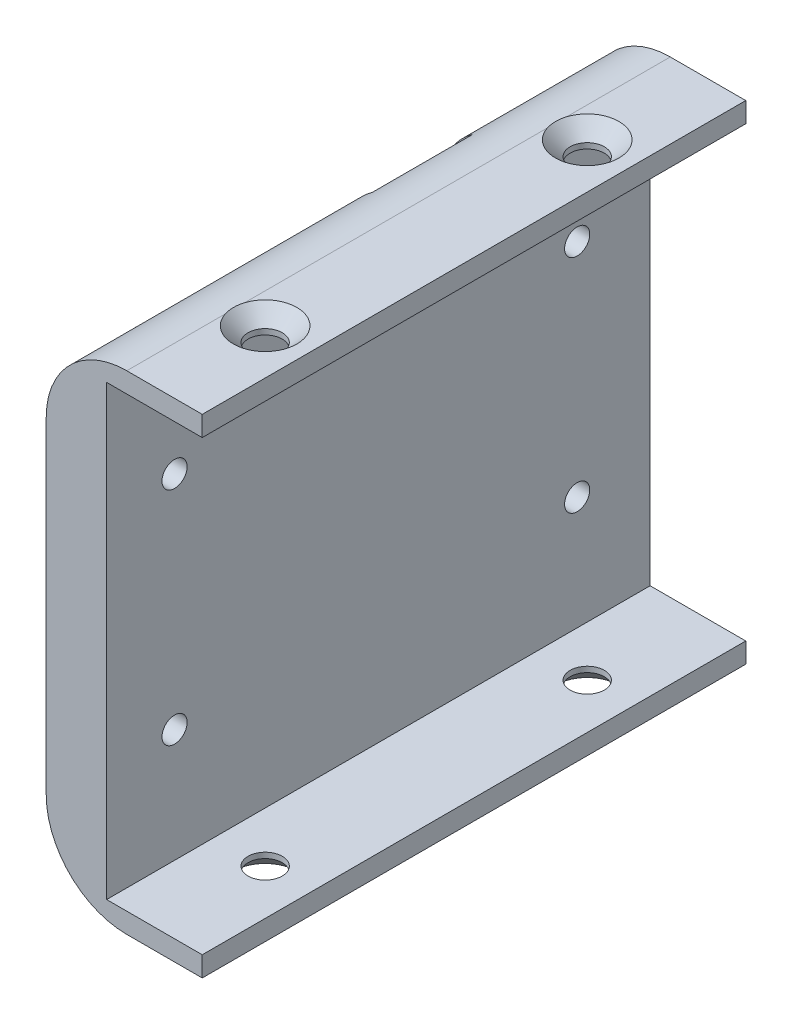
ISO-10303-21;
HEADER;
FILE_DESCRIPTION(('STEP AP214'),'2;1');
FILE_NAME('part.step','',(''),(''),'','','');
FILE_SCHEMA(('AUTOMOTIVE_DESIGN { 1 0 10303 214 1 1 1 1 }'));
ENDSEC;
DATA;
#1=APPLICATION_CONTEXT('core data for automotive mechanical design processes');
#2=APPLICATION_PROTOCOL_DEFINITION('international standard','automotive_design',2000,#1);
#3=PRODUCT_CONTEXT('',#1,'mechanical');
#4=PRODUCT('Part','Part','',(#3));
#5=PRODUCT_RELATED_PRODUCT_CATEGORY('part','',(#4));
#6=PRODUCT_DEFINITION_FORMATION('','',#4);
#7=PRODUCT_DEFINITION_CONTEXT('part definition',#1,'design');
#8=PRODUCT_DEFINITION('design','',#6,#7);
#9=PRODUCT_DEFINITION_SHAPE('','',#8);
#10=(LENGTH_UNIT() NAMED_UNIT(*) SI_UNIT(.MILLI.,.METRE.));
#11=(NAMED_UNIT(*) PLANE_ANGLE_UNIT() SI_UNIT($,.RADIAN.));
#12=(NAMED_UNIT(*) SI_UNIT($,.STERADIAN.) SOLID_ANGLE_UNIT());
#13=UNCERTAINTY_MEASURE_WITH_UNIT(LENGTH_MEASURE(1.E-05),#10,'distance_accuracy_value','');
#14=(GEOMETRIC_REPRESENTATION_CONTEXT(3) GLOBAL_UNCERTAINTY_ASSIGNED_CONTEXT((#13)) GLOBAL_UNIT_ASSIGNED_CONTEXT((#10,
#11,#12)) REPRESENTATION_CONTEXT('',''));
#15=CARTESIAN_POINT('',(0.,0.,0.));
#16=DIRECTION('',(0.,0.,1.));
#17=DIRECTION('',(1.,0.,0.));
#18=AXIS2_PLACEMENT_3D('',#15,#16,#17);
#19=CARTESIAN_POINT('',(-9.9999999999896,24.249999999995,9.25000000000013));
#20=DIRECTION('',(0.,1.,0.));
#21=DIRECTION('',(0.,0.,1.));
#22=AXIS2_PLACEMENT_3D('',#19,#20,#21);
#23=CONICAL_SURFACE('',#22,3.15000000001361,0.785398163397448);
#24=CARTESIAN_POINT('',(-13.0000000000176,24.25,10.2104686355886));
#25=CARTESIAN_POINT('',(-13.024069945026,24.2499950295218,10.1352624912886));
#26=CARTESIAN_POINT('',(-13.045207232172,24.249892138767,10.0591674018904));
#27=CARTESIAN_POINT('',(-13.0816261500583,24.2496051434966,9.90561200485988));
#28=CARTESIAN_POINT('',(-13.0969095696817,24.2494210638287,9.82815212187549));
#29=CARTESIAN_POINT('',(-13.1334525694306,24.2489263156326,9.59780586907413));
#30=CARTESIAN_POINT('',(-13.1464875956657,24.2486625714475,9.44351045960869));
#31=CARTESIAN_POINT('',(-13.1494043263025,24.2486028777726,9.20565171987819));
#32=CARTESIAN_POINT('',(-13.1471591255412,24.2486479387485,9.12207858869993));
#33=CARTESIAN_POINT('',(-13.1361384679381,24.2488438169427,8.95534151919602));
#34=CARTESIAN_POINT('',(-13.127363085835,24.2489946329506,8.87217757619812));
#35=CARTESIAN_POINT('',(-13.1029749505636,24.2493473092372,8.70478215642651));
#36=CARTESIAN_POINT('',(-13.087200332138,24.2495503269641,8.62057426481277));
#37=CARTESIAN_POINT('',(-13.0487673806669,24.2498719364405,8.45372552609859));
#38=CARTESIAN_POINT('',(-13.0261074441732,24.2499905085029,8.3710850487843));
#39=CARTESIAN_POINT('',(-13.0000000000198,24.25,8.28953136441849));
#40=B_SPLINE_CURVE_WITH_KNOTS('',3,(#24,#25,#26,#27,#28,#29,#30,#31,#32,#33,#34,#35,#36,#37,#38,
#39),.UNSPECIFIED.,.F.,.F.,(4,2,2,2,2,2,2,4),(0.,0.236743424387679,0.47341444453291,
0.936034161299941,1.18664393647095,1.43725084342283,1.69398264431785,1.95077427861946),.UNSPECIFIED.);
#41=CARTESIAN_POINT('',(-12.9999999999999,24.2499999999975,10.2104686356357));
#42=VERTEX_POINT('',#41);
#43=CARTESIAN_POINT('',(-13.0000000000098,24.2499999999975,8.28953136439546));
#44=VERTEX_POINT('',#43);
#45=EDGE_CURVE('E163',#42,#44,#40,.T.);
#46=ORIENTED_EDGE('',*,*,#45,.F.);
#47=CARTESIAN_POINT('',(-9.9999999999896,24.249999999995,9.25000000000013));
#48=DIRECTION('',(0.,1.,0.));
#49=DIRECTION('',(0.,0.,1.));
#50=AXIS2_PLACEMENT_3D('',#47,#48,#49);
#51=CIRCLE('',#50,3.15000000001361);
#52=EDGE_CURVE('E148',#42,#44,#51,.T.);
#53=ORIENTED_EDGE('',*,*,#52,.T.);
#54=EDGE_LOOP('',(#46,#53));
#55=FACE_BOUND('',#54,.T.);
#56=CARTESIAN_POINT('',(-9.9999999999896,22.8000000000021,9.25000000000013));
#57=DIRECTION('',(0.,1.,0.));
#58=DIRECTION('',(0.,0.,1.));
#59=AXIS2_PLACEMENT_3D('',#56,#57,#58);
#60=CIRCLE('',#59,1.69999999999999);
#61=CARTESIAN_POINT('',(-9.9999999999896,22.8000000000021,10.9500000000001));
#62=VERTEX_POINT('',#61);
#63=EDGE_CURVE('E281',#62,#62,#60,.F.);
#64=ORIENTED_EDGE('',*,*,#63,.T.);
#65=EDGE_LOOP('',(#64));
#66=FACE_BOUND('',#65,.T.);
#67=ADVANCED_FACE('F17',(#55,#66),#23,.F.);
#68=CARTESIAN_POINT('',(-9.99999999998963,24.2499999999382,41.2500000000001));
#69=DIRECTION('',(0.,1.,0.));
#70=DIRECTION('',(0.,0.,1.));
#71=AXIS2_PLACEMENT_3D('',#68,#69,#70);
#72=CONICAL_SURFACE('',#71,3.14999999999591,0.785398163417049);
#73=CARTESIAN_POINT('',(-13.0000000000536,24.2500000000032,42.2104686356002));
#74=CARTESIAN_POINT('',(-13.0240699450628,24.2499950295229,42.1352624913));
#75=CARTESIAN_POINT('',(-13.0452072322092,24.2498921387671,42.0591674019015));
#76=CARTESIAN_POINT('',(-13.0816261500958,24.2496051434959,41.9056120048703));
#77=CARTESIAN_POINT('',(-13.0969095697192,24.2494210638281,41.8281521218855));
#78=CARTESIAN_POINT('',(-13.1334525694682,24.2489263156322,41.597805869083));
#79=CARTESIAN_POINT('',(-13.1464875957037,24.2486625714468,41.4435104596168));
#80=CARTESIAN_POINT('',(-13.1494043263411,24.2486028777718,41.205651719884));
#81=CARTESIAN_POINT('',(-13.1471591255799,24.2486479387478,41.1220785887041));
#82=CARTESIAN_POINT('',(-13.1361384679768,24.2488438169421,40.955341519197));
#83=CARTESIAN_POINT('',(-13.1273630858738,24.24899463295,40.8721775761975));
#84=CARTESIAN_POINT('',(-13.1029749506022,24.2493473092367,40.7047821564227));
#85=CARTESIAN_POINT('',(-13.0872003321765,24.2495503269637,40.6205742648073));
#86=CARTESIAN_POINT('',(-13.0487673807049,24.2498719364403,40.4537255260898));
#87=CARTESIAN_POINT('',(-13.0261074442109,24.2499905085028,40.3710850487739));
#88=CARTESIAN_POINT('',(-13.0000000000571,24.25,40.2895313644065));
#89=B_SPLINE_CURVE_WITH_KNOTS('',3,(#73,#74,#75,#76,#77,#78,#79,#80,#81,#82,#83,#84,#85,#86,#87,
#88),.UNSPECIFIED.,.F.,.F.,(4,2,2,2,2,2,2,4),(0.,0.236743424388868,0.473414444535229,
0.936034161304567,1.18664393648036,1.437250843437,1.69398264433694,1.95077427864349),.UNSPECIFIED.);
#90=CARTESIAN_POINT('',(-12.9999999999999,24.2499999999691,42.2104686356709));
#91=VERTEX_POINT('',#90);
#92=CARTESIAN_POINT('',(-13.0000000000284,24.2499999999691,40.2895313644184));
#93=VERTEX_POINT('',#92);
#94=EDGE_CURVE('E143',#91,#93,#89,.T.);
#95=ORIENTED_EDGE('',*,*,#94,.F.);
#96=CARTESIAN_POINT('',(-9.99999999998963,24.2499999999382,41.2500000000001));
#97=DIRECTION('',(0.,1.,0.));
#98=DIRECTION('',(0.,0.,1.));
#99=AXIS2_PLACEMENT_3D('',#96,#97,#98);
#100=CIRCLE('',#99,3.14999999999591);
#101=EDGE_CURVE('E21',#91,#93,#100,.T.);
#102=ORIENTED_EDGE('',*,*,#101,.T.);
#103=EDGE_LOOP('',(#95,#102));
#104=FACE_BOUND('',#103,.T.);
#105=CARTESIAN_POINT('',(-9.99999999998963,22.8000000000021,41.2500000000001));
#106=DIRECTION('',(0.,1.,0.));
#107=DIRECTION('',(0.,0.,1.));
#108=AXIS2_PLACEMENT_3D('',#105,#106,#107);
#109=CIRCLE('',#108,1.69999999999999);
#110=CARTESIAN_POINT('',(-9.99999999998963,22.8000000000021,42.9500000000001));
#111=VERTEX_POINT('',#110);
#112=EDGE_CURVE('E278',#111,#111,#109,.F.);
#113=ORIENTED_EDGE('',*,*,#112,.T.);
#114=EDGE_LOOP('',(#113));
#115=FACE_BOUND('',#114,.T.);
#116=ADVANCED_FACE('F141',(#104,#115),#72,.F.);
#117=CARTESIAN_POINT('',(-9.99999999999993,-24.249999999995,9.25000000000013));
#118=DIRECTION('',(0.,-1.,0.));
#119=DIRECTION('',(0.,0.,-1.));
#120=AXIS2_PLACEMENT_3D('',#117,#118,#119);
#121=CONICAL_SURFACE('',#120,3.14999999999658,0.785398163397448);
#122=CARTESIAN_POINT('',(-13.0000000000014,-24.25,8.28953136438468));
#123=CARTESIAN_POINT('',(-13.0240699450105,-24.2499950295218,8.36473750868407));
#124=CARTESIAN_POINT('',(-13.0452072321573,-24.2498921387671,8.44083259808162));
#125=CARTESIAN_POINT('',(-13.0816261500451,-24.2496051434968,8.59438799511101));
#126=CARTESIAN_POINT('',(-13.0969095696693,-24.2494210638288,8.67184787809487));
#127=CARTESIAN_POINT('',(-13.1334525694204,-24.2489263156328,8.90219413089456));
#128=CARTESIAN_POINT('',(-13.1464875956571,-24.2486625714476,9.05648954035898));
#129=CARTESIAN_POINT('',(-13.1494043262965,-24.2486028777727,9.29434828009414));
#130=CARTESIAN_POINT('',(-13.1471591255357,-24.2486479387486,9.377921411278));
#131=CARTESIAN_POINT('',(-13.1361384679326,-24.2488438169428,9.54465848079309));
#132=CARTESIAN_POINT('',(-13.1273630858291,-24.2489946329507,9.62782242379657));
#133=CARTESIAN_POINT('',(-13.1029749505559,-24.2493473092373,9.79521784357958));
#134=CARTESIAN_POINT('',(-13.0872003321289,-24.2495503269642,9.87942573519912));
#135=CARTESIAN_POINT('',(-13.0487673806539,-24.2498719364406,10.0462744739246));
#136=CARTESIAN_POINT('',(-13.0261074441577,-24.2499905085029,10.1289149512444));
#137=CARTESIAN_POINT('',(-13.0000000000014,-24.25,10.2104686356156));
#138=B_SPLINE_CURVE_WITH_KNOTS('',3,(#122,#123,#124,#125,#126,#127,#128,#129,#130,#131,#132,
#133,#134,#135,#136,#137),.UNSPECIFIED.,.F.,.F.,(4,2,2,2,2,2,2,4),(0.,0.236743424386538,
0.473414444530611,0.936034161294968,1.1866439364827,1.43725084345131,1.69398264436416,
1.95077427868361),.UNSPECIFIED.);
#139=CARTESIAN_POINT('',(-13.0000000000007,-24.2500000000018,8.28953136437658));
#140=VERTEX_POINT('',#139);
#141=CARTESIAN_POINT('',(-13.0000000000007,-24.2499999999975,10.2104686356097));
#142=VERTEX_POINT('',#141);
#143=EDGE_CURVE('E341',#140,#142,#138,.T.);
#144=ORIENTED_EDGE('',*,*,#143,.F.);
#145=CARTESIAN_POINT('',(-9.99999999999993,-24.249999999995,9.25000000000013));
#146=DIRECTION('',(0.,-1.,0.));
#147=DIRECTION('',(0.,0.,-1.));
#148=AXIS2_PLACEMENT_3D('',#145,#146,#147);
#149=CIRCLE('',#148,3.14999999999658);
#150=EDGE_CURVE('E337',#140,#142,#149,.T.);
#151=ORIENTED_EDGE('',*,*,#150,.T.);
#152=EDGE_LOOP('',(#144,#151));
#153=FACE_BOUND('',#152,.T.);
#154=CARTESIAN_POINT('',(-9.99999999999993,-22.8,9.25000000000013));
#155=DIRECTION('',(0.,-1.,0.));
#156=DIRECTION('',(0.,0.,-1.));
#157=AXIS2_PLACEMENT_3D('',#154,#155,#156);
#158=CIRCLE('',#157,1.69999999999999);
#159=CARTESIAN_POINT('',(-9.99999999999993,-22.8,7.55000000000014));
#160=VERTEX_POINT('',#159);
#161=EDGE_CURVE('E172',#160,#160,#158,.F.);
#162=ORIENTED_EDGE('',*,*,#161,.T.);
#163=EDGE_LOOP('',(#162));
#164=FACE_BOUND('',#163,.T.);
#165=ADVANCED_FACE('F356',(#153,#164),#121,.F.);
#166=CARTESIAN_POINT('',(-9.99999999999996,-24.249999999995,41.2500000000001));
#167=DIRECTION('',(0.,-1.,0.));
#168=DIRECTION('',(0.,0.,-1.));
#169=AXIS2_PLACEMENT_3D('',#166,#167,#168);
#170=CONICAL_SURFACE('',#169,3.15000000001428,0.785398163397448);
#171=CARTESIAN_POINT('',(-13.0000000000176,-24.2500000000017,40.2895313643794));
#172=CARTESIAN_POINT('',(-13.0240699450273,-24.2499950295224,40.3647375086791));
#173=CARTESIAN_POINT('',(-13.0452072321743,-24.2498921387671,40.4408325980771));
#174=CARTESIAN_POINT('',(-13.0816261500624,-24.2496051434964,40.5943879951074));
#175=CARTESIAN_POINT('',(-13.0969095696865,-24.2494210638286,40.6718478780918));
#176=CARTESIAN_POINT('',(-13.1334525694378,-24.2489263156326,40.9021941308929));
#177=CARTESIAN_POINT('',(-13.1464875956745,-24.2486625714473,41.0564895403582));
#178=CARTESIAN_POINT('',(-13.1494043263139,-24.2486028777723,41.2943482800947));
#179=CARTESIAN_POINT('',(-13.1471591255531,-24.2486479387483,41.377921411279));
#180=CARTESIAN_POINT('',(-13.1361384679499,-24.2488438169425,41.5446584807949));
#181=CARTESIAN_POINT('',(-13.1273630858465,-24.2489946329504,41.6278224237988));
#182=CARTESIAN_POINT('',(-13.1029749505731,-24.2493473092371,41.7952178435826));
#183=CARTESIAN_POINT('',(-13.0872003321461,-24.249550326964,41.8794257352026));
#184=CARTESIAN_POINT('',(-13.048767380671,-24.2498719364405,42.0462744739289));
#185=CARTESIAN_POINT('',(-13.0261074441748,-24.2499905085029,42.1289149512491));
#186=CARTESIAN_POINT('',(-13.0000000000184,-24.25,42.2104686356207));
#187=B_SPLINE_CURVE_WITH_KNOTS('',3,(#171,#172,#173,#174,#175,#176,#177,#178,#179,#180,#181,
#182,#183,#184,#185,#186),.UNSPECIFIED.,.F.,.F.,(4,2,2,2,2,2,2,4),(0.,0.236743424387996,
0.473414444533513,0.936034161300674,1.18664393648962,1.43725084345944,1.69398264437354,
1.95077427869423),.UNSPECIFIED.);
#188=CARTESIAN_POINT('',(-13.0000000000091,-24.2499999999929,40.2895313643738));
#189=VERTEX_POINT('',#188);
#190=CARTESIAN_POINT('',(-13.0000000000091,-24.2499999999975,42.2104686356415));
#191=VERTEX_POINT('',#190);
#192=EDGE_CURVE('E350',#189,#191,#187,.T.);
#193=ORIENTED_EDGE('',*,*,#192,.F.);
#194=CARTESIAN_POINT('',(-9.99999999999996,-24.249999999995,41.2500000000001));
#195=DIRECTION('',(0.,-1.,0.));
#196=DIRECTION('',(0.,0.,-1.));
#197=AXIS2_PLACEMENT_3D('',#194,#195,#196);
#198=CIRCLE('',#197,3.15000000001428);
#199=EDGE_CURVE('E332',#189,#191,#198,.T.);
#200=ORIENTED_EDGE('',*,*,#199,.T.);
#201=EDGE_LOOP('',(#193,#200));
#202=FACE_BOUND('',#201,.T.);
#203=CARTESIAN_POINT('',(-9.99999999999996,-22.8,41.2500000000001));
#204=DIRECTION('',(0.,-1.,0.));
#205=DIRECTION('',(0.,0.,-1.));
#206=AXIS2_PLACEMENT_3D('',#203,#204,#205);
#207=CIRCLE('',#206,1.69999999999999);
#208=CARTESIAN_POINT('',(-9.99999999999996,-22.8,39.5500000000001));
#209=VERTEX_POINT('',#208);
#210=EDGE_CURVE('E275',#209,#209,#207,.F.);
#211=ORIENTED_EDGE('',*,*,#210,.T.);
#212=EDGE_LOOP('',(#211));
#213=FACE_BOUND('',#212,.T.);
#214=ADVANCED_FACE('F391',(#202,#213),#170,.F.);
#215=CARTESIAN_POINT('',(-9.9999999999896,24.2500000000021,9.25000000000013));
#216=DIRECTION('',(0.,1.,0.));
#217=DIRECTION('',(0.,0.,1.));
#218=AXIS2_PLACEMENT_3D('',#215,#216,#217);
#219=CYLINDRICAL_SURFACE('',#218,1.69999999999999);
#220=CARTESIAN_POINT('',(-9.9999999999896,22.2499999999992,9.25000000000013));
#221=DIRECTION('',(0.,1.,0.));
#222=DIRECTION('',(0.,0.,1.));
#223=AXIS2_PLACEMENT_3D('',#220,#221,#222);
#224=CIRCLE('',#223,1.69999999999999);
#225=CARTESIAN_POINT('',(-9.9999999999896,22.2499999999992,10.9500000000001));
#226=VERTEX_POINT('',#225);
#227=EDGE_CURVE('E313',#226,#226,#224,.F.);
#228=ORIENTED_EDGE('',*,*,#227,.T.);
#229=EDGE_LOOP('',(#228));
#230=FACE_BOUND('',#229,.T.);
#231=ORIENTED_EDGE('',*,*,#63,.F.);
#232=EDGE_LOOP('',(#231));
#233=FACE_BOUND('',#232,.T.);
#234=ADVANCED_FACE('F543',(#230,#233),#219,.F.);
#235=CARTESIAN_POINT('',(-9.99999999998963,24.2500000000021,41.2500000000001));
#236=DIRECTION('',(0.,1.,0.));
#237=DIRECTION('',(0.,0.,1.));
#238=AXIS2_PLACEMENT_3D('',#235,#236,#237);
#239=CYLINDRICAL_SURFACE('',#238,1.69999999999999);
#240=CARTESIAN_POINT('',(-9.99999999998963,22.2499999999992,41.2500000000001));
#241=DIRECTION('',(0.,1.,0.));
#242=DIRECTION('',(0.,0.,1.));
#243=AXIS2_PLACEMENT_3D('',#240,#241,#242);
#244=CIRCLE('',#243,1.69999999999999);
#245=CARTESIAN_POINT('',(-9.99999999998963,22.2499999999992,42.9500000000001));
#246=VERTEX_POINT('',#245);
#247=EDGE_CURVE('E189',#246,#246,#244,.F.);
#248=ORIENTED_EDGE('',*,*,#247,.T.);
#249=EDGE_LOOP('',(#248));
#250=FACE_BOUND('',#249,.T.);
#251=ORIENTED_EDGE('',*,*,#112,.F.);
#252=EDGE_LOOP('',(#251));
#253=FACE_BOUND('',#252,.T.);
#254=ADVANCED_FACE('F539',(#250,#253),#239,.F.);
#255=CARTESIAN_POINT('',(-9.99999999999996,-24.25,41.2500000000001));
#256=DIRECTION('',(0.,-1.,0.));
#257=DIRECTION('',(0.,0.,-1.));
#258=AXIS2_PLACEMENT_3D('',#255,#256,#257);
#259=CYLINDRICAL_SURFACE('',#258,1.69999999999999);
#260=CARTESIAN_POINT('',(-9.99999999999996,-22.2500000000009,41.2500000000001));
#261=DIRECTION('',(0.,-1.,0.));
#262=DIRECTION('',(0.,0.,-1.));
#263=AXIS2_PLACEMENT_3D('',#260,#261,#262);
#264=CIRCLE('',#263,1.69999999999999);
#265=CARTESIAN_POINT('',(-9.99999999999996,-22.2500000000009,39.5500000000001));
#266=VERTEX_POINT('',#265);
#267=EDGE_CURVE('E223',#266,#266,#264,.F.);
#268=ORIENTED_EDGE('',*,*,#267,.T.);
#269=EDGE_LOOP('',(#268));
#270=FACE_BOUND('',#269,.T.);
#271=ORIENTED_EDGE('',*,*,#210,.F.);
#272=EDGE_LOOP('',(#271));
#273=FACE_BOUND('',#272,.T.);
#274=ADVANCED_FACE('F533',(#270,#273),#259,.F.);
#275=CARTESIAN_POINT('',(-9.99999999999993,-24.25,9.25000000000013));
#276=DIRECTION('',(0.,-1.,0.));
#277=DIRECTION('',(0.,0.,-1.));
#278=AXIS2_PLACEMENT_3D('',#275,#276,#277);
#279=CYLINDRICAL_SURFACE('',#278,1.69999999999999);
#280=CARTESIAN_POINT('',(-9.99999999999993,-22.2500000000009,9.25000000000013));
#281=DIRECTION('',(0.,-1.,0.));
#282=DIRECTION('',(0.,0.,-1.));
#283=AXIS2_PLACEMENT_3D('',#280,#281,#282);
#284=CIRCLE('',#283,1.69999999999999);
#285=CARTESIAN_POINT('',(-9.99999999999993,-22.2500000000009,7.55000000000014));
#286=VERTEX_POINT('',#285);
#287=EDGE_CURVE('E219',#286,#286,#284,.F.);
#288=ORIENTED_EDGE('',*,*,#287,.T.);
#289=EDGE_LOOP('',(#288));
#290=FACE_BOUND('',#289,.T.);
#291=ORIENTED_EDGE('',*,*,#161,.F.);
#292=EDGE_LOOP('',(#291));
#293=FACE_BOUND('',#292,.T.);
#294=ADVANCED_FACE('F528',(#290,#293),#279,.F.);
#295=CARTESIAN_POINT('',(-5.49999999999992,22.2499999999992,103.416598472404));
#296=DIRECTION('',(-1.,0.,0.));
#297=DIRECTION('',(0.,0.,1.));
#298=AXIS2_PLACEMENT_3D('',#295,#296,#297);
#299=PLANE('',#298);
#300=DIRECTION('',(0.,0.,1.));
#301=VECTOR('',#300,1.);
#302=CARTESIAN_POINT('',(-5.49999999999992,22.2499999999992,103.416598472404));
#303=LINE('',#302,#301);
#304=CARTESIAN_POINT('',(-5.49999999999992,22.2499999999992,52.));
#305=VERTEX_POINT('',#304);
#306=CARTESIAN_POINT('',(-5.49999999999992,22.2499999999992,-2.));
#307=VERTEX_POINT('',#306);
#308=EDGE_CURVE('E185',#305,#307,#303,.F.);
#309=ORIENTED_EDGE('',*,*,#308,.T.);
#310=DIRECTION('',(0.,1.,0.));
#311=VECTOR('',#310,1.);
#312=CARTESIAN_POINT('',(-5.49999999999992,-16.25,-2.));
#313=LINE('',#312,#311);
#314=CARTESIAN_POINT('',(-5.49999999999992,24.25,-2.));
#315=VERTEX_POINT('',#314);
#316=EDGE_CURVE('E201',#315,#307,#313,.F.);
#317=ORIENTED_EDGE('',*,*,#316,.F.);
#318=DIRECTION('',(0.,0.,-1.));
#319=VECTOR('',#318,1.);
#320=CARTESIAN_POINT('',(-5.49999999999992,24.25,103.416598472404));
#321=LINE('',#320,#319);
#322=CARTESIAN_POINT('',(-5.49999999999992,24.25,52.));
#323=VERTEX_POINT('',#322);
#324=EDGE_CURVE('E149',#315,#323,#321,.F.);
#325=ORIENTED_EDGE('',*,*,#324,.T.);
#326=DIRECTION('',(0.,-1.,0.));
#327=VECTOR('',#326,1.);
#328=CARTESIAN_POINT('',(-5.49999999999992,0.,52.0000000000001));
#329=LINE('',#328,#327);
#330=EDGE_CURVE('E175',#305,#323,#329,.F.);
#331=ORIENTED_EDGE('',*,*,#330,.F.);
#332=EDGE_LOOP('',(#309,#317,#325,#331));
#333=FACE_BOUND('',#332,.T.);
#334=ADVANCED_FACE('F526',(#333),#299,.F.);
#335=CARTESIAN_POINT('',(-5.49999999999992,24.25,103.416598472404));
#336=DIRECTION('',(0.,-1.,0.));
#337=DIRECTION('',(0.,0.,-1.));
#338=AXIS2_PLACEMENT_3D('',#335,#336,#337);
#339=PLANE('',#338);
#340=ORIENTED_EDGE('',*,*,#52,.F.);
#341=DIRECTION('',(0.,0.,-1.));
#342=VECTOR('',#341,1.);
#343=CARTESIAN_POINT('',(-12.9999999999999,24.25,103.416598472404));
#344=LINE('',#343,#342);
#345=EDGE_CURVE('E154',#93,#42,#344,.T.);
#346=ORIENTED_EDGE('',*,*,#345,.F.);
#347=ORIENTED_EDGE('',*,*,#101,.F.);
#348=DIRECTION('',(0.,0.,-1.));
#349=VECTOR('',#348,1.);
#350=CARTESIAN_POINT('',(-12.9999999999999,24.25,103.416598472404));
#351=LINE('',#350,#349);
#352=CARTESIAN_POINT('',(-12.9999999999999,24.25,52.0000000000001));
#353=VERTEX_POINT('',#352);
#354=EDGE_CURVE('E157',#353,#91,#351,.T.);
#355=ORIENTED_EDGE('',*,*,#354,.F.);
#356=DIRECTION('',(1.,0.,0.));
#357=VECTOR('',#356,1.);
#358=CARTESIAN_POINT('',(29.5701693961332,24.25,52.));
#359=LINE('',#358,#357);
#360=EDGE_CURVE('E177',#323,#353,#359,.F.);
#361=ORIENTED_EDGE('',*,*,#360,.F.);
#362=ORIENTED_EDGE('',*,*,#324,.F.);
#363=DIRECTION('',(-1.,0.,0.));
#364=VECTOR('',#363,1.);
#365=CARTESIAN_POINT('',(-12.9999999999999,24.25,-2.));
#366=LINE('',#365,#364);
#367=CARTESIAN_POINT('',(-12.9999999999999,24.25,-2.));
#368=VERTEX_POINT('',#367);
#369=EDGE_CURVE('E204',#368,#315,#366,.F.);
#370=ORIENTED_EDGE('',*,*,#369,.F.);
#371=DIRECTION('',(0.,0.,-1.));
#372=VECTOR('',#371,1.);
#373=CARTESIAN_POINT('',(-12.9999999999999,24.25,103.416598472404));
#374=LINE('',#373,#372);
#375=EDGE_CURVE('E165',#44,#368,#374,.T.);
#376=ORIENTED_EDGE('',*,*,#375,.F.);
#377=EDGE_LOOP('',(#340,#346,#347,#355,#361,#362,#370,#376));
#378=FACE_BOUND('',#377,.T.);
#379=ADVANCED_FACE('F160',(#378),#339,.F.);
#380=CARTESIAN_POINT('',(-12.9999999999999,16.25,103.416598472404));
#381=DIRECTION('',(0.,0.,-1.));
#382=DIRECTION('',(-1.,0.,0.));
#383=AXIS2_PLACEMENT_3D('',#380,#381,#382);
#384=CYLINDRICAL_SURFACE('',#383,8.00000000000004);
#385=ORIENTED_EDGE('',*,*,#354,.T.);
#386=ORIENTED_EDGE('',*,*,#94,.T.);
#387=ORIENTED_EDGE('',*,*,#345,.T.);
#388=ORIENTED_EDGE('',*,*,#45,.T.);
#389=ORIENTED_EDGE('',*,*,#375,.T.);
#390=CARTESIAN_POINT('',(-12.9999999999999,16.25,-2.));
#391=DIRECTION('',(0.,0.,-1.));
#392=DIRECTION('',(-1.,0.,0.));
#393=AXIS2_PLACEMENT_3D('',#390,#391,#392);
#394=CIRCLE('',#393,8.00000000000004);
#395=CARTESIAN_POINT('',(-20.9999999999999,16.25,-2.));
#396=VERTEX_POINT('',#395);
#397=EDGE_CURVE('E304',#396,#368,#394,.T.);
#398=ORIENTED_EDGE('',*,*,#397,.F.);
#399=DIRECTION('',(0.,0.,1.));
#400=VECTOR('',#399,1.);
#401=CARTESIAN_POINT('',(-20.9999999999999,16.25,103.416598472404));
#402=LINE('',#401,#400);
#403=CARTESIAN_POINT('',(-20.9999999999999,16.25,52.0000000000001));
#404=VERTEX_POINT('',#403);
#405=EDGE_CURVE('E158',#396,#404,#402,.T.);
#406=ORIENTED_EDGE('',*,*,#405,.T.);
#407=CARTESIAN_POINT('',(-12.9999999999999,16.25,52.0000000000001));
#408=DIRECTION('',(0.,0.,-1.));
#409=DIRECTION('',(-1.,0.,0.));
#410=AXIS2_PLACEMENT_3D('',#407,#408,#409);
#411=CIRCLE('',#410,8.00000000000004);
#412=EDGE_CURVE('E298',#353,#404,#411,.F.);
#413=ORIENTED_EDGE('',*,*,#412,.F.);
#414=EDGE_LOOP('',(#385,#386,#387,#388,#389,#398,#406,#413));
#415=FACE_BOUND('',#414,.T.);
#416=DIRECTION('',(0.,0.,1.));
#417=VECTOR('',#416,1.);
#418=CARTESIAN_POINT('',(-20.2144610189473,19.7071017060666,23.));
#419=LINE('',#418,#417);
#420=CARTESIAN_POINT('',(-20.2144610189473,19.7071017060666,23.));
#421=VERTEX_POINT('',#420);
#422=CARTESIAN_POINT('',(-20.2144610189473,19.7071017060666,13.));
#423=VERTEX_POINT('',#422);
#424=EDGE_CURVE('E259',#421,#423,#419,.F.);
#425=ORIENTED_EDGE('',*,*,#424,.T.);
#426=CARTESIAN_POINT('',(-12.9999999999999,16.25,13.));
#427=DIRECTION('',(0.,0.,-1.));
#428=DIRECTION('',(-1.,0.,0.));
#429=AXIS2_PLACEMENT_3D('',#426,#427,#428);
#430=CIRCLE('',#429,8.00000000000004);
#431=CARTESIAN_POINT('',(-17.6268087939806,22.7763037305923,13.));
#432=VERTEX_POINT('',#431);
#433=EDGE_CURVE('E270',#423,#432,#430,.T.);
#434=ORIENTED_EDGE('',*,*,#433,.T.);
#435=DIRECTION('',(0.,0.,1.));
#436=VECTOR('',#435,1.);
#437=CARTESIAN_POINT('',(-17.6268087939806,22.7763037305923,23.));
#438=LINE('',#437,#436);
#439=CARTESIAN_POINT('',(-17.6268087939806,22.7763037305923,23.));
#440=VERTEX_POINT('',#439);
#441=EDGE_CURVE('E226',#432,#440,#438,.T.);
#442=ORIENTED_EDGE('',*,*,#441,.T.);
#443=CARTESIAN_POINT('',(-12.9999999999999,16.25,23.));
#444=DIRECTION('',(0.,0.,-1.));
#445=DIRECTION('',(-1.,0.,0.));
#446=AXIS2_PLACEMENT_3D('',#443,#444,#445);
#447=CIRCLE('',#446,8.00000000000004);
#448=EDGE_CURVE('E263',#440,#421,#447,.F.);
#449=ORIENTED_EDGE('',*,*,#448,.T.);
#450=EDGE_LOOP('',(#425,#434,#442,#449));
#451=FACE_BOUND('',#450,.T.);
#452=ADVANCED_FACE('F152',(#415,#451),#384,.T.);
#453=CARTESIAN_POINT('',(-20.9999999999999,-16.25,103.416598472404));
#454=DIRECTION('',(1.,0.,0.));
#455=DIRECTION('',(0.,1.,0.));
#456=AXIS2_PLACEMENT_3D('',#453,#454,#455);
#457=PLANE('',#456);
#458=ORIENTED_EDGE('',*,*,#405,.F.);
#459=DIRECTION('',(0.,1.,0.));
#460=VECTOR('',#459,1.);
#461=CARTESIAN_POINT('',(-20.9999999999999,-16.25,-2.));
#462=LINE('',#461,#460);
#463=CARTESIAN_POINT('',(-20.9999999999999,-16.25,-2.));
#464=VERTEX_POINT('',#463);
#465=EDGE_CURVE('E307',#464,#396,#462,.T.);
#466=ORIENTED_EDGE('',*,*,#465,.F.);
#467=DIRECTION('',(0.,0.,-1.));
#468=VECTOR('',#467,1.);
#469=CARTESIAN_POINT('',(-20.9999999999999,-16.25,103.416598472404));
#470=LINE('',#469,#468);
#471=CARTESIAN_POINT('',(-20.9999999999999,-16.25,52.0000000000001));
#472=VERTEX_POINT('',#471);
#473=EDGE_CURVE('E349',#472,#464,#470,.T.);
#474=ORIENTED_EDGE('',*,*,#473,.F.);
#475=DIRECTION('',(0.,-1.,0.));
#476=VECTOR('',#475,1.);
#477=CARTESIAN_POINT('',(-20.9999999999999,0.,52.0000000000001));
#478=LINE('',#477,#476);
#479=EDGE_CURVE('E297',#404,#472,#478,.T.);
#480=ORIENTED_EDGE('',*,*,#479,.F.);
#481=EDGE_LOOP('',(#458,#466,#474,#480));
#482=FACE_BOUND('',#481,.T.);
#483=CARTESIAN_POINT('',(-20.9999999999999,10.9999999999999,5.24999999999997));
#484=DIRECTION('',(-1.,0.,0.));
#485=DIRECTION('',(0.,-1.,0.));
#486=AXIS2_PLACEMENT_3D('',#483,#484,#485);
#487=CIRCLE('',#486,1.25000000000092);
#488=CARTESIAN_POINT('',(-20.9999999999999,9.749999999999,5.24999999999997));
#489=VERTEX_POINT('',#488);
#490=EDGE_CURVE('E316',#489,#489,#487,.F.);
#491=ORIENTED_EDGE('',*,*,#490,.T.);
#492=EDGE_LOOP('',(#491));
#493=FACE_BOUND('',#492,.T.);
#494=CARTESIAN_POINT('',(-20.9999999999999,-11.0000000000001,45.25));
#495=DIRECTION('',(-1.,0.,0.));
#496=DIRECTION('',(0.,-1.,0.));
#497=AXIS2_PLACEMENT_3D('',#494,#495,#496);
#498=CIRCLE('',#497,1.25000000000092);
#499=CARTESIAN_POINT('',(-20.9999999999999,-12.250000000001,45.25));
#500=VERTEX_POINT('',#499);
#501=EDGE_CURVE('E319',#500,#500,#498,.F.);
#502=ORIENTED_EDGE('',*,*,#501,.T.);
#503=EDGE_LOOP('',(#502));
#504=FACE_BOUND('',#503,.T.);
#505=CARTESIAN_POINT('',(-20.9999999999999,-11.0000000000001,5.24999999999997));
#506=DIRECTION('',(-1.,0.,0.));
#507=DIRECTION('',(0.,-1.,0.));
#508=AXIS2_PLACEMENT_3D('',#505,#506,#507);
#509=CIRCLE('',#508,1.25000000000091);
#510=CARTESIAN_POINT('',(-20.9999999999999,-12.250000000001,5.24999999999997));
#511=VERTEX_POINT('',#510);
#512=EDGE_CURVE('E322',#511,#511,#509,.F.);
#513=ORIENTED_EDGE('',*,*,#512,.T.);
#514=EDGE_LOOP('',(#513));
#515=FACE_BOUND('',#514,.T.);
#516=CARTESIAN_POINT('',(-20.9999999999999,10.9999999999999,45.25));
#517=DIRECTION('',(-1.,0.,0.));
#518=DIRECTION('',(0.,-1.,0.));
#519=AXIS2_PLACEMENT_3D('',#516,#517,#518);
#520=CIRCLE('',#519,1.25000000000093);
#521=CARTESIAN_POINT('',(-20.9999999999999,9.74999999999899,45.25));
#522=VERTEX_POINT('',#521);
#523=EDGE_CURVE('E234',#522,#522,#520,.F.);
#524=ORIENTED_EDGE('',*,*,#523,.T.);
#525=EDGE_LOOP('',(#524));
#526=FACE_BOUND('',#525,.T.);
#527=ADVANCED_FACE('F364',(#482,#493,#504,#515,#526),#457,.F.);
#528=CARTESIAN_POINT('',(-12.9999999999999,-16.25,103.416598472404));
#529=DIRECTION('',(0.,0.,-1.));
#530=DIRECTION('',(-1.,0.,0.));
#531=AXIS2_PLACEMENT_3D('',#528,#529,#530);
#532=CYLINDRICAL_SURFACE('',#531,8.);
#533=DIRECTION('',(0.,0.,1.));
#534=VECTOR('',#533,1.);
#535=CARTESIAN_POINT('',(-12.9999999999999,-24.25,103.416598472404));
#536=LINE('',#535,#534);
#537=CARTESIAN_POINT('',(-12.9999999999999,-24.25,-2.));
#538=VERTEX_POINT('',#537);
#539=EDGE_CURVE('E340',#538,#140,#536,.T.);
#540=ORIENTED_EDGE('',*,*,#539,.T.);
#541=ORIENTED_EDGE('',*,*,#143,.T.);
#542=DIRECTION('',(0.,0.,1.));
#543=VECTOR('',#542,1.);
#544=CARTESIAN_POINT('',(-12.9999999999999,-24.25,103.416598472404));
#545=LINE('',#544,#543);
#546=EDGE_CURVE('E336',#142,#189,#545,.T.);
#547=ORIENTED_EDGE('',*,*,#546,.T.);
#548=ORIENTED_EDGE('',*,*,#192,.T.);
#549=DIRECTION('',(0.,0.,1.));
#550=VECTOR('',#549,1.);
#551=CARTESIAN_POINT('',(-12.9999999999999,-24.25,103.416598472404));
#552=LINE('',#551,#550);
#553=CARTESIAN_POINT('',(-12.9999999999999,-24.25,52.0000000000001));
#554=VERTEX_POINT('',#553);
#555=EDGE_CURVE('E335',#191,#554,#552,.T.);
#556=ORIENTED_EDGE('',*,*,#555,.T.);
#557=CARTESIAN_POINT('',(-12.9999999999999,-16.25,52.0000000000001));
#558=DIRECTION('',(0.,0.,-1.));
#559=DIRECTION('',(-1.,0.,0.));
#560=AXIS2_PLACEMENT_3D('',#557,#558,#559);
#561=CIRCLE('',#560,8.);
#562=EDGE_CURVE('E294',#472,#554,#561,.F.);
#563=ORIENTED_EDGE('',*,*,#562,.F.);
#564=ORIENTED_EDGE('',*,*,#473,.T.);
#565=CARTESIAN_POINT('',(-12.9999999999999,-16.25,-2.));
#566=DIRECTION('',(0.,0.,-1.));
#567=DIRECTION('',(-1.,0.,0.));
#568=AXIS2_PLACEMENT_3D('',#565,#566,#567);
#569=CIRCLE('',#568,8.);
#570=EDGE_CURVE('E308',#538,#464,#569,.T.);
#571=ORIENTED_EDGE('',*,*,#570,.F.);
#572=EDGE_LOOP('',(#540,#541,#547,#548,#556,#563,#564,#571));
#573=FACE_BOUND('',#572,.T.);
#574=ADVANCED_FACE('F358',(#573),#532,.T.);
#575=CARTESIAN_POINT('',(-5.49999999999992,-24.25,103.416598472404));
#576=DIRECTION('',(0.,1.,0.));
#577=DIRECTION('',(0.,0.,1.));
#578=AXIS2_PLACEMENT_3D('',#575,#576,#577);
#579=PLANE('',#578);
#580=ORIENTED_EDGE('',*,*,#199,.F.);
#581=ORIENTED_EDGE('',*,*,#546,.F.);
#582=ORIENTED_EDGE('',*,*,#150,.F.);
#583=ORIENTED_EDGE('',*,*,#539,.F.);
#584=DIRECTION('',(-1.,0.,0.));
#585=VECTOR('',#584,1.);
#586=CARTESIAN_POINT('',(-12.9999999999999,-24.25,-2.));
#587=LINE('',#586,#585);
#588=CARTESIAN_POINT('',(-5.49999999999992,-24.25,-2.));
#589=VERTEX_POINT('',#588);
#590=EDGE_CURVE('E209',#589,#538,#587,.T.);
#591=ORIENTED_EDGE('',*,*,#590,.F.);
#592=DIRECTION('',(0.,0.,1.));
#593=VECTOR('',#592,1.);
#594=CARTESIAN_POINT('',(-5.49999999999992,-24.25,103.416598472404));
#595=LINE('',#594,#593);
#596=CARTESIAN_POINT('',(-5.49999999999992,-24.25,52.0000000000001));
#597=VERTEX_POINT('',#596);
#598=EDGE_CURVE('E331',#589,#597,#595,.T.);
#599=ORIENTED_EDGE('',*,*,#598,.T.);
#600=DIRECTION('',(1.,0.,0.));
#601=VECTOR('',#600,1.);
#602=CARTESIAN_POINT('',(29.5701693961332,-24.25,52.0000000000001));
#603=LINE('',#602,#601);
#604=EDGE_CURVE('E296',#554,#597,#603,.T.);
#605=ORIENTED_EDGE('',*,*,#604,.F.);
#606=ORIENTED_EDGE('',*,*,#555,.F.);
#607=EDGE_LOOP('',(#580,#581,#582,#583,#591,#599,#605,#606));
#608=FACE_BOUND('',#607,.T.);
#609=ADVANCED_FACE('F363',(#608),#579,.F.);
#610=CARTESIAN_POINT('',(-5.49999999999992,-22.2500000000009,103.416598472404));
#611=DIRECTION('',(-1.,0.,0.));
#612=DIRECTION('',(0.,0.,1.));
#613=AXIS2_PLACEMENT_3D('',#610,#611,#612);
#614=PLANE('',#613);
#615=ORIENTED_EDGE('',*,*,#598,.F.);
#616=DIRECTION('',(0.,1.,0.));
#617=VECTOR('',#616,1.);
#618=CARTESIAN_POINT('',(-5.49999999999992,-16.25,-2.));
#619=LINE('',#618,#617);
#620=CARTESIAN_POINT('',(-5.49999999999992,-22.2500000000009,-2.));
#621=VERTEX_POINT('',#620);
#622=EDGE_CURVE('E188',#621,#589,#619,.F.);
#623=ORIENTED_EDGE('',*,*,#622,.F.);
#624=DIRECTION('',(0.,0.,1.));
#625=VECTOR('',#624,1.);
#626=CARTESIAN_POINT('',(-5.49999999999992,-22.2500000000009,103.416598472404));
#627=LINE('',#626,#625);
#628=CARTESIAN_POINT('',(-5.49999999999992,-22.2500000000009,52.0000000000001));
#629=VERTEX_POINT('',#628);
#630=EDGE_CURVE('E212',#621,#629,#627,.T.);
#631=ORIENTED_EDGE('',*,*,#630,.T.);
#632=DIRECTION('',(0.,-1.,0.));
#633=VECTOR('',#632,1.);
#634=CARTESIAN_POINT('',(-5.49999999999992,0.,52.0000000000001));
#635=LINE('',#634,#633);
#636=EDGE_CURVE('E256',#597,#629,#635,.F.);
#637=ORIENTED_EDGE('',*,*,#636,.F.);
#638=EDGE_LOOP('',(#615,#623,#631,#637));
#639=FACE_BOUND('',#638,.T.);
#640=ADVANCED_FACE('F448',(#639),#614,.F.);
#641=CARTESIAN_POINT('',(-4.39273507756037,9.54223001417208,23.));
#642=DIRECTION('',(0.,0.,1.));
#643=DIRECTION('',(1.,0.,0.));
#644=AXIS2_PLACEMENT_3D('',#641,#642,#643);
#645=PLANE('',#644);
#646=DIRECTION('',(0.,-1.,0.));
#647=VECTOR('',#646,1.);
#648=CARTESIAN_POINT('',(-14.9999999999999,22.2499999999992,23.));
#649=LINE('',#648,#647);
#650=CARTESIAN_POINT('',(-14.9999999999999,20.1494949366117,23.));
#651=VERTEX_POINT('',#650);
#652=CARTESIAN_POINT('',(-14.9999999999999,14.4926406871193,23.));
#653=VERTEX_POINT('',#652);
#654=EDGE_CURVE('E253',#651,#653,#649,.T.);
#655=ORIENTED_EDGE('',*,*,#654,.T.);
#656=DIRECTION('',(0.707106781186546,-0.707106781186549,0.));
#657=VECTOR('',#656,1.);
#658=CARTESIAN_POINT('',(-7.22116220230656,6.71380288942589,23.));
#659=LINE('',#658,#657);
#660=EDGE_CURVE('E262',#653,#421,#659,.F.);
#661=ORIENTED_EDGE('',*,*,#660,.T.);
#662=ORIENTED_EDGE('',*,*,#448,.F.);
#663=DIRECTION('',(-0.707106781186546,0.707106781186549,0.));
#664=VECTOR('',#663,1.);
#665=CARTESIAN_POINT('',(-4.39273507756037,9.54223001417208,23.));
#666=LINE('',#665,#664);
#667=EDGE_CURVE('E229',#440,#651,#666,.F.);
#668=ORIENTED_EDGE('',*,*,#667,.T.);
#669=EDGE_LOOP('',(#655,#661,#662,#668));
#670=FACE_BOUND('',#669,.T.);
#671=ADVANCED_FACE('F445',(#670),#645,.F.);
#672=CARTESIAN_POINT('',(-7.22116220230656,6.71380288942589,23.));
#673=DIRECTION('',(-0.707106781186549,-0.707106781186546,0.));
#674=DIRECTION('',(0.707106781186546,-0.707106781186549,0.));
#675=AXIS2_PLACEMENT_3D('',#672,#673,#674);
#676=PLANE('',#675);
#677=DIRECTION('',(0.,0.,1.));
#678=VECTOR('',#677,1.);
#679=CARTESIAN_POINT('',(-14.9999999999999,14.4926406871193,103.416598472404));
#680=LINE('',#679,#678);
#681=CARTESIAN_POINT('',(-14.9999999999999,14.4926406871193,13.));
#682=VERTEX_POINT('',#681);
#683=EDGE_CURVE('E246',#653,#682,#680,.F.);
#684=ORIENTED_EDGE('',*,*,#683,.T.);
#685=DIRECTION('',(-0.707106781186546,0.707106781186549,0.));
#686=VECTOR('',#685,1.);
#687=CARTESIAN_POINT('',(-14.9999999999999,14.4926406871193,13.));
#688=LINE('',#687,#686);
#689=EDGE_CURVE('E230',#682,#423,#688,.T.);
#690=ORIENTED_EDGE('',*,*,#689,.T.);
#691=ORIENTED_EDGE('',*,*,#424,.F.);
#692=ORIENTED_EDGE('',*,*,#660,.F.);
#693=EDGE_LOOP('',(#684,#690,#691,#692));
#694=FACE_BOUND('',#693,.T.);
#695=ADVANCED_FACE('F441',(#694),#676,.F.);
#696=CARTESIAN_POINT('',(-4.39273507756037,9.54223001417208,13.));
#697=DIRECTION('',(0.,0.,-1.));
#698=DIRECTION('',(-1.,0.,0.));
#699=AXIS2_PLACEMENT_3D('',#696,#697,#698);
#700=PLANE('',#699);
#701=DIRECTION('',(0.,-1.,0.));
#702=VECTOR('',#701,1.);
#703=CARTESIAN_POINT('',(-14.9999999999999,22.2499999999992,13.));
#704=LINE('',#703,#702);
#705=CARTESIAN_POINT('',(-14.9999999999999,20.1494949366117,13.));
#706=VERTEX_POINT('',#705);
#707=EDGE_CURVE('E241',#682,#706,#704,.F.);
#708=ORIENTED_EDGE('',*,*,#707,.T.);
#709=DIRECTION('',(-0.707106781186546,0.707106781186549,0.));
#710=VECTOR('',#709,1.);
#711=CARTESIAN_POINT('',(-4.39273507756037,9.54223001417208,13.));
#712=LINE('',#711,#710);
#713=EDGE_CURVE('E231',#706,#432,#712,.T.);
#714=ORIENTED_EDGE('',*,*,#713,.T.);
#715=ORIENTED_EDGE('',*,*,#433,.F.);
#716=ORIENTED_EDGE('',*,*,#689,.F.);
#717=EDGE_LOOP('',(#708,#714,#715,#716));
#718=FACE_BOUND('',#717,.T.);
#719=ADVANCED_FACE('F437',(#718),#700,.F.);
#720=CARTESIAN_POINT('',(-4.39273507756037,9.54223001417208,23.));
#721=DIRECTION('',(0.707106781186549,0.707106781186546,0.));
#722=DIRECTION('',(-0.707106781186546,0.707106781186549,0.));
#723=AXIS2_PLACEMENT_3D('',#720,#721,#722);
#724=PLANE('',#723);
#725=DIRECTION('',(0.,0.,1.));
#726=VECTOR('',#725,1.);
#727=CARTESIAN_POINT('',(-14.9999999999999,20.1494949366117,103.416598472404));
#728=LINE('',#727,#726);
#729=EDGE_CURVE('E237',#706,#651,#728,.T.);
#730=ORIENTED_EDGE('',*,*,#729,.T.);
#731=ORIENTED_EDGE('',*,*,#667,.F.);
#732=ORIENTED_EDGE('',*,*,#441,.F.);
#733=ORIENTED_EDGE('',*,*,#713,.F.);
#734=EDGE_LOOP('',(#730,#731,#732,#733));
#735=FACE_BOUND('',#734,.T.);
#736=ADVANCED_FACE('F433',(#735),#724,.F.);
#737=CARTESIAN_POINT('',(-5.49899999999992,10.9999999999999,45.25));
#738=DIRECTION('',(-1.,0.,0.));
#739=DIRECTION('',(0.,-1.,0.));
#740=AXIS2_PLACEMENT_3D('',#737,#738,#739);
#741=CYLINDRICAL_SURFACE('',#740,1.25000000000093);
#742=ORIENTED_EDGE('',*,*,#523,.F.);
#743=EDGE_LOOP('',(#742));
#744=FACE_BOUND('',#743,.T.);
#745=CARTESIAN_POINT('',(-14.9999999999999,10.9999999999999,45.25));
#746=DIRECTION('',(-1.,0.,0.));
#747=DIRECTION('',(0.,-1.,0.));
#748=AXIS2_PLACEMENT_3D('',#745,#746,#747);
#749=CIRCLE('',#748,1.25000000000093);
#750=CARTESIAN_POINT('',(-14.9999999999999,9.74999999999899,45.25));
#751=VERTEX_POINT('',#750);
#752=EDGE_CURVE('E240',#751,#751,#749,.F.);
#753=ORIENTED_EDGE('',*,*,#752,.T.);
#754=EDGE_LOOP('',(#753));
#755=FACE_BOUND('',#754,.T.);
#756=ADVANCED_FACE('F429',(#744,#755),#741,.F.);
#757=CARTESIAN_POINT('',(-5.49899999999992,-11.0000000000001,5.24999999999997));
#758=DIRECTION('',(-1.,0.,0.));
#759=DIRECTION('',(0.,-1.,0.));
#760=AXIS2_PLACEMENT_3D('',#757,#758,#759);
#761=CYLINDRICAL_SURFACE('',#760,1.25000000000091);
#762=ORIENTED_EDGE('',*,*,#512,.F.);
#763=EDGE_LOOP('',(#762));
#764=FACE_BOUND('',#763,.T.);
#765=CARTESIAN_POINT('',(-14.9999999999999,-11.0000000000001,5.24999999999997));
#766=DIRECTION('',(-1.,0.,0.));
#767=DIRECTION('',(0.,-1.,0.));
#768=AXIS2_PLACEMENT_3D('',#765,#766,#767);
#769=CIRCLE('',#768,1.25000000000091);
#770=CARTESIAN_POINT('',(-14.9999999999999,-12.250000000001,5.24999999999997));
#771=VERTEX_POINT('',#770);
#772=EDGE_CURVE('E289',#771,#771,#769,.F.);
#773=ORIENTED_EDGE('',*,*,#772,.T.);
#774=EDGE_LOOP('',(#773));
#775=FACE_BOUND('',#774,.T.);
#776=ADVANCED_FACE('F425',(#764,#775),#761,.F.);
#777=CARTESIAN_POINT('',(-5.49899999999992,-11.0000000000001,45.25));
#778=DIRECTION('',(-1.,0.,0.));
#779=DIRECTION('',(0.,-1.,0.));
#780=AXIS2_PLACEMENT_3D('',#777,#778,#779);
#781=CYLINDRICAL_SURFACE('',#780,1.25000000000092);
#782=ORIENTED_EDGE('',*,*,#501,.F.);
#783=EDGE_LOOP('',(#782));
#784=FACE_BOUND('',#783,.T.);
#785=CARTESIAN_POINT('',(-14.9999999999999,-11.0000000000001,45.25));
#786=DIRECTION('',(-1.,0.,0.));
#787=DIRECTION('',(0.,-1.,0.));
#788=AXIS2_PLACEMENT_3D('',#785,#786,#787);
#789=CIRCLE('',#788,1.25000000000092);
#790=CARTESIAN_POINT('',(-14.9999999999999,-12.250000000001,45.25));
#791=VERTEX_POINT('',#790);
#792=EDGE_CURVE('E286',#791,#791,#789,.F.);
#793=ORIENTED_EDGE('',*,*,#792,.T.);
#794=EDGE_LOOP('',(#793));
#795=FACE_BOUND('',#794,.T.);
#796=ADVANCED_FACE('F421',(#784,#795),#781,.F.);
#797=CARTESIAN_POINT('',(-5.49899999999992,10.9999999999999,5.24999999999997));
#798=DIRECTION('',(-1.,0.,0.));
#799=DIRECTION('',(0.,-1.,0.));
#800=AXIS2_PLACEMENT_3D('',#797,#798,#799);
#801=CYLINDRICAL_SURFACE('',#800,1.25000000000092);
#802=ORIENTED_EDGE('',*,*,#490,.F.);
#803=EDGE_LOOP('',(#802));
#804=FACE_BOUND('',#803,.T.);
#805=CARTESIAN_POINT('',(-14.9999999999999,10.9999999999999,5.24999999999997));
#806=DIRECTION('',(-1.,0.,0.));
#807=DIRECTION('',(0.,-1.,0.));
#808=AXIS2_PLACEMENT_3D('',#805,#806,#807);
#809=CIRCLE('',#808,1.25000000000092);
#810=CARTESIAN_POINT('',(-14.9999999999999,9.749999999999,5.24999999999997));
#811=VERTEX_POINT('',#810);
#812=EDGE_CURVE('E196',#811,#811,#809,.F.);
#813=ORIENTED_EDGE('',*,*,#812,.T.);
#814=EDGE_LOOP('',(#813));
#815=FACE_BOUND('',#814,.T.);
#816=ADVANCED_FACE('F417',(#804,#815),#801,.F.);
#817=CARTESIAN_POINT('',(-14.9999999999999,22.2499999999992,103.416598472404));
#818=DIRECTION('',(0.,1.,0.));
#819=DIRECTION('',(0.,0.,1.));
#820=AXIS2_PLACEMENT_3D('',#817,#818,#819);
#821=PLANE('',#820);
#822=DIRECTION('',(0.,0.,1.));
#823=VECTOR('',#822,1.);
#824=CARTESIAN_POINT('',(-14.9999999999999,22.2499999999992,103.416598472404));
#825=LINE('',#824,#823);
#826=CARTESIAN_POINT('',(-14.9999999999999,22.2499999999992,52.));
#827=VERTEX_POINT('',#826);
#828=CARTESIAN_POINT('',(-14.9999999999999,22.2499999999992,-2.));
#829=VERTEX_POINT('',#828);
#830=EDGE_CURVE('E192',#827,#829,#825,.F.);
#831=ORIENTED_EDGE('',*,*,#830,.T.);
#832=DIRECTION('',(-1.,0.,0.));
#833=VECTOR('',#832,1.);
#834=CARTESIAN_POINT('',(-12.9999999999999,22.2499999999992,-2.));
#835=LINE('',#834,#833);
#836=EDGE_CURVE('E203',#307,#829,#835,.T.);
#837=ORIENTED_EDGE('',*,*,#836,.F.);
#838=ORIENTED_EDGE('',*,*,#308,.F.);
#839=DIRECTION('',(1.,0.,0.));
#840=VECTOR('',#839,1.);
#841=CARTESIAN_POINT('',(29.5701693961332,22.2499999999992,52.));
#842=LINE('',#841,#840);
#843=EDGE_CURVE('E178',#827,#305,#842,.T.);
#844=ORIENTED_EDGE('',*,*,#843,.F.);
#845=EDGE_LOOP('',(#831,#837,#838,#844));
#846=FACE_BOUND('',#845,.T.);
#847=ORIENTED_EDGE('',*,*,#247,.F.);
#848=EDGE_LOOP('',(#847));
#849=FACE_BOUND('',#848,.T.);
#850=ORIENTED_EDGE('',*,*,#227,.F.);
#851=EDGE_LOOP('',(#850));
#852=FACE_BOUND('',#851,.T.);
#853=ADVANCED_FACE('F413',(#846,#849,#852),#821,.F.);
#854=CARTESIAN_POINT('',(-12.9999999999999,-16.25,-2.));
#855=DIRECTION('',(0.,0.,-1.));
#856=DIRECTION('',(-1.,0.,0.));
#857=AXIS2_PLACEMENT_3D('',#854,#855,#856);
#858=PLANE('',#857);
#859=ORIENTED_EDGE('',*,*,#316,.T.);
#860=ORIENTED_EDGE('',*,*,#836,.T.);
#861=DIRECTION('',(0.,-1.,0.));
#862=VECTOR('',#861,1.);
#863=CARTESIAN_POINT('',(-14.9999999999999,22.2499999999992,-2.));
#864=LINE('',#863,#862);
#865=CARTESIAN_POINT('',(-14.9999999999999,-22.2500000000009,-2.));
#866=VERTEX_POINT('',#865);
#867=EDGE_CURVE('E195',#829,#866,#864,.T.);
#868=ORIENTED_EDGE('',*,*,#867,.T.);
#869=DIRECTION('',(1.,0.,0.));
#870=VECTOR('',#869,1.);
#871=CARTESIAN_POINT('',(-14.9999999999999,-22.2500000000009,-2.));
#872=LINE('',#871,#870);
#873=EDGE_CURVE('E214',#866,#621,#872,.T.);
#874=ORIENTED_EDGE('',*,*,#873,.T.);
#875=ORIENTED_EDGE('',*,*,#622,.T.);
#876=ORIENTED_EDGE('',*,*,#590,.T.);
#877=ORIENTED_EDGE('',*,*,#570,.T.);
#878=ORIENTED_EDGE('',*,*,#465,.T.);
#879=ORIENTED_EDGE('',*,*,#397,.T.);
#880=ORIENTED_EDGE('',*,*,#369,.T.);
#881=EDGE_LOOP('',(#859,#860,#868,#874,#875,#876,#877,#878,#879,#880));
#882=FACE_BOUND('',#881,.T.);
#883=ADVANCED_FACE('F409',(#882),#858,.T.);
#884=CARTESIAN_POINT('',(-14.9999999999999,-22.2500000000009,103.416598472404));
#885=DIRECTION('',(0.,-1.,0.));
#886=DIRECTION('',(1.,0.,0.));
#887=AXIS2_PLACEMENT_3D('',#884,#885,#886);
#888=PLANE('',#887);
#889=ORIENTED_EDGE('',*,*,#630,.F.);
#890=ORIENTED_EDGE('',*,*,#873,.F.);
#891=DIRECTION('',(0.,0.,1.));
#892=VECTOR('',#891,1.);
#893=CARTESIAN_POINT('',(-14.9999999999999,-22.2500000000009,103.416598472404));
#894=LINE('',#893,#892);
#895=CARTESIAN_POINT('',(-14.9999999999999,-22.2500000000009,52.0000000000001));
#896=VERTEX_POINT('',#895);
#897=EDGE_CURVE('E27',#866,#896,#894,.T.);
#898=ORIENTED_EDGE('',*,*,#897,.T.);
#899=DIRECTION('',(1.,0.,0.));
#900=VECTOR('',#899,1.);
#901=CARTESIAN_POINT('',(29.5701693961332,-22.2500000000009,52.0000000000001));
#902=LINE('',#901,#900);
#903=EDGE_CURVE('E35',#629,#896,#902,.F.);
#904=ORIENTED_EDGE('',*,*,#903,.F.);
#905=EDGE_LOOP('',(#889,#890,#898,#904));
#906=FACE_BOUND('',#905,.T.);
#907=ORIENTED_EDGE('',*,*,#287,.F.);
#908=EDGE_LOOP('',(#907));
#909=FACE_BOUND('',#908,.T.);
#910=ORIENTED_EDGE('',*,*,#267,.F.);
#911=EDGE_LOOP('',(#910));
#912=FACE_BOUND('',#911,.T.);
#913=ADVANCED_FACE('F402',(#906,#909,#912),#888,.F.);
#914=CARTESIAN_POINT('',(29.5701693961332,0.,52.0000000000001));
#915=DIRECTION('',(0.,0.,1.));
#916=DIRECTION('',(0.,-1.,0.));
#917=AXIS2_PLACEMENT_3D('',#914,#915,#916);
#918=PLANE('',#917);
#919=ORIENTED_EDGE('',*,*,#604,.T.);
#920=ORIENTED_EDGE('',*,*,#636,.T.);
#921=ORIENTED_EDGE('',*,*,#903,.T.);
#922=DIRECTION('',(0.,-1.,0.));
#923=VECTOR('',#922,1.);
#924=CARTESIAN_POINT('',(-14.9999999999999,22.2499999999992,52.0000000000001));
#925=LINE('',#924,#923);
#926=EDGE_CURVE('E11',#896,#827,#925,.F.);
#927=ORIENTED_EDGE('',*,*,#926,.T.);
#928=ORIENTED_EDGE('',*,*,#843,.T.);
#929=ORIENTED_EDGE('',*,*,#330,.T.);
#930=ORIENTED_EDGE('',*,*,#360,.T.);
#931=ORIENTED_EDGE('',*,*,#412,.T.);
#932=ORIENTED_EDGE('',*,*,#479,.T.);
#933=ORIENTED_EDGE('',*,*,#562,.T.);
#934=EDGE_LOOP('',(#919,#920,#921,#927,#928,#929,#930,#931,#932,#933));
#935=FACE_BOUND('',#934,.T.);
#936=ADVANCED_FACE('F396',(#935),#918,.T.);
#937=CARTESIAN_POINT('',(-14.9999999999999,22.2499999999992,103.416598472404));
#938=DIRECTION('',(-1.,0.,0.));
#939=DIRECTION('',(0.,-1.,0.));
#940=AXIS2_PLACEMENT_3D('',#937,#938,#939);
#941=PLANE('',#940);
#942=ORIENTED_EDGE('',*,*,#897,.F.);
#943=ORIENTED_EDGE('',*,*,#867,.F.);
#944=ORIENTED_EDGE('',*,*,#830,.F.);
#945=ORIENTED_EDGE('',*,*,#926,.F.);
#946=EDGE_LOOP('',(#942,#943,#944,#945));
#947=FACE_BOUND('',#946,.T.);
#948=ORIENTED_EDGE('',*,*,#812,.F.);
#949=EDGE_LOOP('',(#948));
#950=FACE_BOUND('',#949,.T.);
#951=ORIENTED_EDGE('',*,*,#792,.F.);
#952=EDGE_LOOP('',(#951));
#953=FACE_BOUND('',#952,.T.);
#954=ORIENTED_EDGE('',*,*,#772,.F.);
#955=EDGE_LOOP('',(#954));
#956=FACE_BOUND('',#955,.T.);
#957=ORIENTED_EDGE('',*,*,#752,.F.);
#958=EDGE_LOOP('',(#957));
#959=FACE_BOUND('',#958,.T.);
#960=ORIENTED_EDGE('',*,*,#707,.F.);
#961=ORIENTED_EDGE('',*,*,#683,.F.);
#962=ORIENTED_EDGE('',*,*,#654,.F.);
#963=ORIENTED_EDGE('',*,*,#729,.F.);
#964=EDGE_LOOP('',(#960,#961,#962,#963));
#965=FACE_BOUND('',#964,.T.);
#966=ADVANCED_FACE('F394',(#947,#950,#953,#956,#959,#965),#941,.F.);
#967=CLOSED_SHELL('',(#67,#116,#165,#214,#234,#254,#274,#294,#334,#379,#452,#527,#574,#609,#640,
#671,#695,#719,#736,#756,#776,#796,#816,#853,#883,#913,#936,#966));
#968=MANIFOLD_SOLID_BREP('B1',#967);
#969=ADVANCED_BREP_SHAPE_REPRESENTATION('',(#18,#968),#14);
#970=SHAPE_DEFINITION_REPRESENTATION(#9,#969);
ENDSEC;
END-ISO-10303-21;
